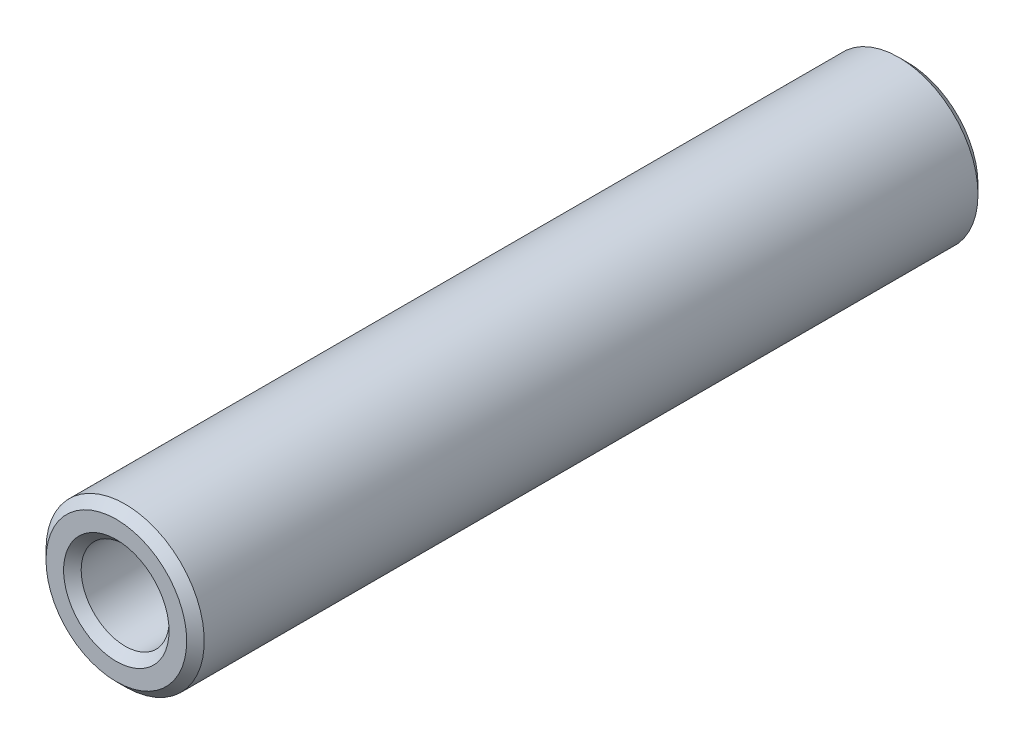
ISO-10303-21;
HEADER;
FILE_DESCRIPTION(('STEP AP214'),'2;1');
FILE_NAME('part.step','',(''),(''),'','','');
FILE_SCHEMA(('AUTOMOTIVE_DESIGN { 1 0 10303 214 1 1 1 1 }'));
ENDSEC;
DATA;
#1=APPLICATION_CONTEXT('core data for automotive mechanical design processes');
#2=APPLICATION_PROTOCOL_DEFINITION('international standard','automotive_design',2000,#1);
#3=PRODUCT_CONTEXT('',#1,'mechanical');
#4=PRODUCT('Part','Part','',(#3));
#5=PRODUCT_RELATED_PRODUCT_CATEGORY('part','',(#4));
#6=PRODUCT_DEFINITION_FORMATION('','',#4);
#7=PRODUCT_DEFINITION_CONTEXT('part definition',#1,'design');
#8=PRODUCT_DEFINITION('design','',#6,#7);
#9=PRODUCT_DEFINITION_SHAPE('','',#8);
#10=(LENGTH_UNIT() NAMED_UNIT(*) SI_UNIT(.MILLI.,.METRE.));
#11=(NAMED_UNIT(*) PLANE_ANGLE_UNIT() SI_UNIT($,.RADIAN.));
#12=(NAMED_UNIT(*) SI_UNIT($,.STERADIAN.) SOLID_ANGLE_UNIT());
#13=UNCERTAINTY_MEASURE_WITH_UNIT(LENGTH_MEASURE(1.E-05),#10,'distance_accuracy_value','');
#14=(GEOMETRIC_REPRESENTATION_CONTEXT(3) GLOBAL_UNCERTAINTY_ASSIGNED_CONTEXT((#13)) GLOBAL_UNIT_ASSIGNED_CONTEXT((#10,
#11,#12)) REPRESENTATION_CONTEXT('',''));
#15=CARTESIAN_POINT('',(0.,0.,0.));
#16=DIRECTION('',(0.,0.,1.));
#17=DIRECTION('',(1.,0.,0.));
#18=AXIS2_PLACEMENT_3D('',#15,#16,#17);
#19=CARTESIAN_POINT('',(0.,0.,22.5));
#20=DIRECTION('',(0.,0.,1.));
#21=DIRECTION('',(1.,0.,0.));
#22=AXIS2_PLACEMENT_3D('',#19,#20,#21);
#23=PLANE('',#22);
#24=CARTESIAN_POINT('',(0.,0.,22.5));
#25=DIRECTION('',(0.,0.,1.));
#26=DIRECTION('',(1.,0.,0.));
#27=AXIS2_PLACEMENT_3D('',#24,#25,#26);
#28=CIRCLE('',#27,3.00000000000003);
#29=CARTESIAN_POINT('',(3.00000000000003,0.,22.5));
#30=VERTEX_POINT('',#29);
#31=EDGE_CURVE('E10',#30,#30,#28,.F.);
#32=ORIENTED_EDGE('',*,*,#31,.T.);
#33=EDGE_LOOP('',(#32));
#34=FACE_BOUND('',#33,.T.);
#35=CARTESIAN_POINT('',(0.,0.,22.5));
#36=DIRECTION('',(0.,0.,1.));
#37=DIRECTION('',(1.,0.,0.));
#38=AXIS2_PLACEMENT_3D('',#35,#36,#37);
#39=CIRCLE('',#38,4.00000000000001);
#40=CARTESIAN_POINT('',(4.00000000000001,0.,22.5));
#41=VERTEX_POINT('',#40);
#42=EDGE_CURVE('E48',#41,#41,#39,.T.);
#43=ORIENTED_EDGE('',*,*,#42,.T.);
#44=EDGE_LOOP('',(#43));
#45=FACE_BOUND('',#44,.T.);
#46=ADVANCED_FACE('F39',(#34,#45),#23,.T.);
#47=CARTESIAN_POINT('',(0.,0.,-22.5));
#48=DIRECTION('',(0.,0.,1.));
#49=DIRECTION('',(1.,0.,0.));
#50=AXIS2_PLACEMENT_3D('',#47,#48,#49);
#51=PLANE('',#50);
#52=CARTESIAN_POINT('',(0.,0.,-22.5));
#53=DIRECTION('',(0.,0.,1.));
#54=DIRECTION('',(1.,0.,0.));
#55=AXIS2_PLACEMENT_3D('',#52,#53,#54);
#56=CIRCLE('',#55,2.99999999999999);
#57=CARTESIAN_POINT('',(2.99999999999999,0.,-22.5));
#58=VERTEX_POINT('',#57);
#59=EDGE_CURVE('E72',#58,#58,#56,.T.);
#60=ORIENTED_EDGE('',*,*,#59,.T.);
#61=EDGE_LOOP('',(#60));
#62=FACE_BOUND('',#61,.T.);
#63=CARTESIAN_POINT('',(0.,0.,-22.5));
#64=DIRECTION('',(0.,0.,1.));
#65=DIRECTION('',(1.,0.,0.));
#66=AXIS2_PLACEMENT_3D('',#63,#64,#65);
#67=CIRCLE('',#66,3.99999999999998);
#68=CARTESIAN_POINT('',(3.99999999999998,0.,-22.5));
#69=VERTEX_POINT('',#68);
#70=EDGE_CURVE('E76',#69,#69,#67,.F.);
#71=ORIENTED_EDGE('',*,*,#70,.T.);
#72=EDGE_LOOP('',(#71));
#73=FACE_BOUND('',#72,.T.);
#74=ADVANCED_FACE('F81',(#62,#73),#51,.F.);
#75=CARTESIAN_POINT('',(0.,0.,22.5));
#76=DIRECTION('',(0.,0.,-1.));
#77=DIRECTION('',(-1.,0.,0.));
#78=AXIS2_PLACEMENT_3D('',#75,#76,#77);
#79=CYLINDRICAL_SURFACE('',#78,4.5);
#80=CARTESIAN_POINT('',(0.,0.,-22.));
#81=DIRECTION('',(0.,0.,1.));
#82=DIRECTION('',(1.,0.,0.));
#83=AXIS2_PLACEMENT_3D('',#80,#81,#82);
#84=CIRCLE('',#83,4.5);
#85=CARTESIAN_POINT('',(-4.5,0.,-22.));
#86=VERTEX_POINT('',#85);
#87=EDGE_CURVE('E53',#86,#86,#84,.T.);
#88=CARTESIAN_POINT('',(0.,0.,22.));
#89=DIRECTION('',(0.,0.,1.));
#90=DIRECTION('',(1.,0.,0.));
#91=AXIS2_PLACEMENT_3D('',#88,#89,#90);
#92=CIRCLE('',#91,4.5);
#93=CARTESIAN_POINT('',(-4.5,0.,22.));
#94=VERTEX_POINT('',#93);
#95=EDGE_CURVE('E58',#94,#94,#92,.F.);
#96=CARTESIAN_POINT('',(-4.5,0.,-22.));
#97=CARTESIAN_POINT('',(-4.5,0.,-21.5416666666667));
#98=CARTESIAN_POINT('',(-4.5,0.,-21.0833333333333));
#99=CARTESIAN_POINT('',(-4.5,0.,-20.1666666666667));
#100=CARTESIAN_POINT('',(-4.5,0.,-19.7083333333333));
#101=CARTESIAN_POINT('',(-4.5,0.,-18.7916666666667));
#102=CARTESIAN_POINT('',(-4.5,0.,-18.3333333333333));
#103=CARTESIAN_POINT('',(-4.5,0.,-17.4166666666667));
#104=CARTESIAN_POINT('',(-4.5,0.,-16.9583333333333));
#105=CARTESIAN_POINT('',(-4.5,0.,-16.0416666666667));
#106=CARTESIAN_POINT('',(-4.5,0.,-15.5833333333333));
#107=CARTESIAN_POINT('',(-4.5,0.,-14.6666666666667));
#108=CARTESIAN_POINT('',(-4.5,0.,-14.2083333333333));
#109=CARTESIAN_POINT('',(-4.5,0.,-13.2916666666667));
#110=CARTESIAN_POINT('',(-4.5,0.,-12.8333333333333));
#111=CARTESIAN_POINT('',(-4.5,0.,-11.9166666666667));
#112=CARTESIAN_POINT('',(-4.5,0.,-11.4583333333333));
#113=CARTESIAN_POINT('',(-4.5,0.,-10.5416666666667));
#114=CARTESIAN_POINT('',(-4.5,0.,-10.0833333333333));
#115=CARTESIAN_POINT('',(-4.5,0.,-9.16666666666666));
#116=CARTESIAN_POINT('',(-4.5,0.,-8.70833333333333));
#117=CARTESIAN_POINT('',(-4.5,0.,-7.79166666666666));
#118=CARTESIAN_POINT('',(-4.5,0.,-7.33333333333333));
#119=CARTESIAN_POINT('',(-4.5,0.,-6.41666666666666));
#120=CARTESIAN_POINT('',(-4.5,0.,-5.95833333333333));
#121=CARTESIAN_POINT('',(-4.5,0.,-5.04166666666666));
#122=CARTESIAN_POINT('',(-4.5,0.,-4.58333333333333));
#123=CARTESIAN_POINT('',(-4.5,0.,-3.66666666666666));
#124=CARTESIAN_POINT('',(-4.5,0.,-3.20833333333333));
#125=CARTESIAN_POINT('',(-4.5,0.,-2.29166666666666));
#126=CARTESIAN_POINT('',(-4.5,0.,-1.83333333333333));
#127=CARTESIAN_POINT('',(-4.5,0.,-0.916666666666661));
#128=CARTESIAN_POINT('',(-4.5,0.,-0.458333333333327));
#129=CARTESIAN_POINT('',(-4.5,0.,0.458333333333341));
#130=CARTESIAN_POINT('',(-4.5,0.,0.916666666666674));
#131=CARTESIAN_POINT('',(-4.5,0.,1.83333333333334));
#132=CARTESIAN_POINT('',(-4.5,0.,2.29166666666667));
#133=CARTESIAN_POINT('',(-4.5,0.,3.20833333333334));
#134=CARTESIAN_POINT('',(-4.5,0.,3.66666666666667));
#135=CARTESIAN_POINT('',(-4.5,0.,4.58333333333334));
#136=CARTESIAN_POINT('',(-4.5,0.,5.04166666666667));
#137=CARTESIAN_POINT('',(-4.5,0.,5.95833333333334));
#138=CARTESIAN_POINT('',(-4.5,0.,6.41666666666667));
#139=CARTESIAN_POINT('',(-4.5,0.,7.33333333333334));
#140=CARTESIAN_POINT('',(-4.5,0.,7.79166666666667));
#141=CARTESIAN_POINT('',(-4.5,0.,8.70833333333334));
#142=CARTESIAN_POINT('',(-4.5,0.,9.16666666666667));
#143=CARTESIAN_POINT('',(-4.5,0.,10.0833333333333));
#144=CARTESIAN_POINT('',(-4.5,0.,10.5416666666667));
#145=CARTESIAN_POINT('',(-4.5,0.,11.4583333333333));
#146=CARTESIAN_POINT('',(-4.5,0.,11.9166666666667));
#147=CARTESIAN_POINT('',(-4.5,0.,12.8333333333333));
#148=CARTESIAN_POINT('',(-4.5,0.,13.2916666666667));
#149=CARTESIAN_POINT('',(-4.5,0.,14.2083333333333));
#150=CARTESIAN_POINT('',(-4.5,0.,14.6666666666667));
#151=CARTESIAN_POINT('',(-4.5,0.,15.5833333333333));
#152=CARTESIAN_POINT('',(-4.5,0.,16.0416666666667));
#153=CARTESIAN_POINT('',(-4.5,0.,16.9583333333333));
#154=CARTESIAN_POINT('',(-4.5,0.,17.4166666666667));
#155=CARTESIAN_POINT('',(-4.5,0.,18.3333333333333));
#156=CARTESIAN_POINT('',(-4.5,0.,18.7916666666667));
#157=CARTESIAN_POINT('',(-4.5,0.,19.7083333333333));
#158=CARTESIAN_POINT('',(-4.5,0.,20.1666666666667));
#159=CARTESIAN_POINT('',(-4.5,0.,21.0833333333333));
#160=CARTESIAN_POINT('',(-4.5,0.,21.5416666666667));
#161=CARTESIAN_POINT('',(-4.5,0.,22.));
#162=B_SPLINE_CURVE_WITH_KNOTS('',3,(#96,#97,#98,#99,#100,#101,#102,#103,#104,#105,#106,#107,
#108,#109,#110,#111,#112,#113,#114,#115,#116,#117,#118,#119,#120,#121,#122,#123,#124,#125,#126,
#127,#128,#129,#130,#131,#132,#133,#134,#135,#136,#137,#138,#139,#140,#141,#142,#143,#144,#145,
#146,#147,#148,#149,#150,#151,#152,#153,#154,#155,#156,#157,#158,#159,#160,#161),.UNSPECIFIED.,
.F.,.F.,(4,2,2,2,2,2,2,2,2,2,2,2,2,2,2,2,2,2,2,2,2,2,2,2,2,2,2,2,2,2,2,2,4),(0.,1.375,2.75,
4.125,5.5,6.875,8.25,9.625,11.,12.375,13.75,15.125,16.5,17.875,19.25,20.625,22.,23.375,24.75,
26.125,27.5,28.875,30.25,31.625,33.,34.375,35.75,37.125,38.5,39.875,41.25,42.625,44.),.UNSPECIFIED.);
#163=EDGE_CURVE('BSEAM91',#86,#94,#162,.T.);
#164=ORIENTED_EDGE('',*,*,#87,.T.);
#165=ORIENTED_EDGE('',*,*,#95,.T.);
#166=ORIENTED_EDGE('',*,*,#163,.T.);
#167=ORIENTED_EDGE('',*,*,#163,.F.);
#168=EDGE_LOOP('',(#164,#166,#165,#167));
#169=FACE_BOUND('',#168,.T.);
#170=ADVANCED_FACE('F91',(#169),#79,.T.);
#171=CARTESIAN_POINT('',(0.,0.,22.5));
#172=DIRECTION('',(0.,0.,-1.));
#173=DIRECTION('',(-1.,0.,0.));
#174=AXIS2_PLACEMENT_3D('',#171,#172,#173);
#175=CYLINDRICAL_SURFACE('',#174,2.5);
#176=CARTESIAN_POINT('',(0.,0.,-22.));
#177=DIRECTION('',(0.,0.,1.));
#178=DIRECTION('',(1.,0.,0.));
#179=AXIS2_PLACEMENT_3D('',#176,#177,#178);
#180=CIRCLE('',#179,2.5);
#181=CARTESIAN_POINT('',(-2.5,0.,-22.));
#182=VERTEX_POINT('',#181);
#183=EDGE_CURVE('E64',#182,#182,#180,.F.);
#184=CARTESIAN_POINT('',(0.,0.,22.));
#185=DIRECTION('',(0.,0.,1.));
#186=DIRECTION('',(1.,0.,0.));
#187=AXIS2_PLACEMENT_3D('',#184,#185,#186);
#188=CIRCLE('',#187,2.5);
#189=CARTESIAN_POINT('',(-2.5,0.,22.));
#190=VERTEX_POINT('',#189);
#191=EDGE_CURVE('E68',#190,#190,#188,.T.);
#192=CARTESIAN_POINT('',(-2.5,0.,-22.));
#193=CARTESIAN_POINT('',(-2.5,0.,-21.5416666666667));
#194=CARTESIAN_POINT('',(-2.5,0.,-21.0833333333333));
#195=CARTESIAN_POINT('',(-2.5,0.,-20.1666666666667));
#196=CARTESIAN_POINT('',(-2.5,0.,-19.7083333333333));
#197=CARTESIAN_POINT('',(-2.5,0.,-18.7916666666667));
#198=CARTESIAN_POINT('',(-2.5,0.,-18.3333333333333));
#199=CARTESIAN_POINT('',(-2.5,0.,-17.4166666666667));
#200=CARTESIAN_POINT('',(-2.5,0.,-16.9583333333333));
#201=CARTESIAN_POINT('',(-2.5,0.,-16.0416666666667));
#202=CARTESIAN_POINT('',(-2.5,0.,-15.5833333333333));
#203=CARTESIAN_POINT('',(-2.5,0.,-14.6666666666667));
#204=CARTESIAN_POINT('',(-2.5,0.,-14.2083333333333));
#205=CARTESIAN_POINT('',(-2.5,0.,-13.2916666666667));
#206=CARTESIAN_POINT('',(-2.5,0.,-12.8333333333333));
#207=CARTESIAN_POINT('',(-2.5,0.,-11.9166666666667));
#208=CARTESIAN_POINT('',(-2.5,0.,-11.4583333333333));
#209=CARTESIAN_POINT('',(-2.5,0.,-10.5416666666667));
#210=CARTESIAN_POINT('',(-2.5,0.,-10.0833333333333));
#211=CARTESIAN_POINT('',(-2.5,0.,-9.16666666666668));
#212=CARTESIAN_POINT('',(-2.5,0.,-8.70833333333335));
#213=CARTESIAN_POINT('',(-2.5,0.,-7.79166666666668));
#214=CARTESIAN_POINT('',(-2.5,0.,-7.33333333333335));
#215=CARTESIAN_POINT('',(-2.5,0.,-6.41666666666668));
#216=CARTESIAN_POINT('',(-2.5,0.,-5.95833333333335));
#217=CARTESIAN_POINT('',(-2.5,0.,-5.04166666666668));
#218=CARTESIAN_POINT('',(-2.5,0.,-4.58333333333335));
#219=CARTESIAN_POINT('',(-2.5,0.,-3.66666666666668));
#220=CARTESIAN_POINT('',(-2.5,0.,-3.20833333333335));
#221=CARTESIAN_POINT('',(-2.5,0.,-2.29166666666668));
#222=CARTESIAN_POINT('',(-2.5,0.,-1.83333333333335));
#223=CARTESIAN_POINT('',(-2.5,0.,-0.916666666666685));
#224=CARTESIAN_POINT('',(-2.5,0.,-0.458333333333351));
#225=CARTESIAN_POINT('',(-2.5,0.,0.458333333333316));
#226=CARTESIAN_POINT('',(-2.5,0.,0.91666666666665));
#227=CARTESIAN_POINT('',(-2.5,0.,1.83333333333332));
#228=CARTESIAN_POINT('',(-2.5,0.,2.29166666666665));
#229=CARTESIAN_POINT('',(-2.5,0.,3.20833333333331));
#230=CARTESIAN_POINT('',(-2.5,0.,3.66666666666665));
#231=CARTESIAN_POINT('',(-2.5,0.,4.58333333333331));
#232=CARTESIAN_POINT('',(-2.5,0.,5.04166666666665));
#233=CARTESIAN_POINT('',(-2.5,0.,5.95833333333331));
#234=CARTESIAN_POINT('',(-2.5,0.,6.41666666666665));
#235=CARTESIAN_POINT('',(-2.5,0.,7.33333333333331));
#236=CARTESIAN_POINT('',(-2.5,0.,7.79166666666665));
#237=CARTESIAN_POINT('',(-2.5,0.,8.70833333333331));
#238=CARTESIAN_POINT('',(-2.5,0.,9.16666666666664));
#239=CARTESIAN_POINT('',(-2.5,0.,10.0833333333333));
#240=CARTESIAN_POINT('',(-2.5,0.,10.5416666666666));
#241=CARTESIAN_POINT('',(-2.5,0.,11.4583333333333));
#242=CARTESIAN_POINT('',(-2.5,0.,11.9166666666666));
#243=CARTESIAN_POINT('',(-2.5,0.,12.8333333333333));
#244=CARTESIAN_POINT('',(-2.5,0.,13.2916666666666));
#245=CARTESIAN_POINT('',(-2.5,0.,14.2083333333333));
#246=CARTESIAN_POINT('',(-2.5,0.,14.6666666666666));
#247=CARTESIAN_POINT('',(-2.5,0.,15.5833333333333));
#248=CARTESIAN_POINT('',(-2.5,0.,16.0416666666666));
#249=CARTESIAN_POINT('',(-2.5,0.,16.9583333333333));
#250=CARTESIAN_POINT('',(-2.5,0.,17.4166666666666));
#251=CARTESIAN_POINT('',(-2.5,0.,18.3333333333333));
#252=CARTESIAN_POINT('',(-2.5,0.,18.7916666666666));
#253=CARTESIAN_POINT('',(-2.5,0.,19.7083333333333));
#254=CARTESIAN_POINT('',(-2.5,0.,20.1666666666666));
#255=CARTESIAN_POINT('',(-2.5,0.,21.0833333333333));
#256=CARTESIAN_POINT('',(-2.5,0.,21.5416666666666));
#257=CARTESIAN_POINT('',(-2.5,0.,22.));
#258=B_SPLINE_CURVE_WITH_KNOTS('',3,(#192,#193,#194,#195,#196,#197,#198,#199,#200,#201,#202,
#203,#204,#205,#206,#207,#208,#209,#210,#211,#212,#213,#214,#215,#216,#217,#218,#219,#220,#221,
#222,#223,#224,#225,#226,#227,#228,#229,#230,#231,#232,#233,#234,#235,#236,#237,#238,#239,#240,
#241,#242,#243,#244,#245,#246,#247,#248,#249,#250,#251,#252,#253,#254,#255,#256,#257),
.UNSPECIFIED.,.F.,.F.,(4,2,2,2,2,2,2,2,2,2,2,2,2,2,2,2,2,2,2,2,2,2,2,2,2,2,2,2,2,2,2,2,4),(0.,
1.375,2.75,4.125,5.5,6.875,8.24999999999999,9.62499999999999,11.,12.375,13.75,15.125,16.5,
17.875,19.25,20.625,22.,23.375,24.75,26.125,27.5,28.875,30.25,31.625,33.,34.375,35.75,37.125,
38.5,39.875,41.25,42.625,44.),.UNSPECIFIED.);
#259=EDGE_CURVE('BSEAM94',#182,#190,#258,.T.);
#260=ORIENTED_EDGE('',*,*,#183,.T.);
#261=ORIENTED_EDGE('',*,*,#191,.T.);
#262=ORIENTED_EDGE('',*,*,#259,.T.);
#263=ORIENTED_EDGE('',*,*,#259,.F.);
#264=EDGE_LOOP('',(#260,#262,#261,#263));
#265=FACE_BOUND('',#264,.T.);
#266=ADVANCED_FACE('F94',(#265),#175,.F.);
#267=CARTESIAN_POINT('',(0.,0.,-22.5));
#268=DIRECTION('',(0.,0.,-1.));
#269=DIRECTION('',(-1.,0.,0.));
#270=AXIS2_PLACEMENT_3D('',#267,#268,#269);
#271=CONICAL_SURFACE('',#270,2.99999999999999,0.78539816339744);
#272=ORIENTED_EDGE('',*,*,#183,.F.);
#273=EDGE_LOOP('',(#272));
#274=FACE_BOUND('',#273,.T.);
#275=ORIENTED_EDGE('',*,*,#59,.F.);
#276=EDGE_LOOP('',(#275));
#277=FACE_BOUND('',#276,.T.);
#278=ADVANCED_FACE('F87',(#274,#277),#271,.F.);
#279=CARTESIAN_POINT('',(0.,0.,-22.));
#280=DIRECTION('',(0.,0.,1.));
#281=DIRECTION('',(1.,0.,0.));
#282=AXIS2_PLACEMENT_3D('',#279,#280,#281);
#283=CONICAL_SURFACE('',#282,4.5,0.785398163397459);
#284=ORIENTED_EDGE('',*,*,#70,.F.);
#285=EDGE_LOOP('',(#284));
#286=FACE_BOUND('',#285,.T.);
#287=ORIENTED_EDGE('',*,*,#87,.F.);
#288=EDGE_LOOP('',(#287));
#289=FACE_BOUND('',#288,.T.);
#290=ADVANCED_FACE('F83',(#286,#289),#283,.T.);
#291=CARTESIAN_POINT('',(0.,0.,22.));
#292=DIRECTION('',(0.,0.,1.));
#293=DIRECTION('',(1.,0.,0.));
#294=AXIS2_PLACEMENT_3D('',#291,#292,#293);
#295=CONICAL_SURFACE('',#294,2.5,0.78539816339745);
#296=ORIENTED_EDGE('',*,*,#31,.F.);
#297=EDGE_LOOP('',(#296));
#298=FACE_BOUND('',#297,.T.);
#299=ORIENTED_EDGE('',*,*,#191,.F.);
#300=EDGE_LOOP('',(#299));
#301=FACE_BOUND('',#300,.T.);
#302=ADVANCED_FACE('F86',(#298,#301),#295,.F.);
#303=CARTESIAN_POINT('',(0.,0.,22.5));
#304=DIRECTION('',(0.,0.,-1.));
#305=DIRECTION('',(-1.,0.,0.));
#306=AXIS2_PLACEMENT_3D('',#303,#304,#305);
#307=CONICAL_SURFACE('',#306,4.00000000000001,0.785398163397445);
#308=ORIENTED_EDGE('',*,*,#95,.F.);
#309=EDGE_LOOP('',(#308));
#310=FACE_BOUND('',#309,.T.);
#311=ORIENTED_EDGE('',*,*,#42,.F.);
#312=EDGE_LOOP('',(#311));
#313=FACE_BOUND('',#312,.T.);
#314=ADVANCED_FACE('F42',(#310,#313),#307,.T.);
#315=CLOSED_SHELL('',(#46,#74,#170,#266,#278,#290,#302,#314));
#316=MANIFOLD_SOLID_BREP('B2',#315);
#317=ADVANCED_BREP_SHAPE_REPRESENTATION('',(#18,#316),#14);
#318=SHAPE_DEFINITION_REPRESENTATION(#9,#317);
ENDSEC;
END-ISO-10303-21;
